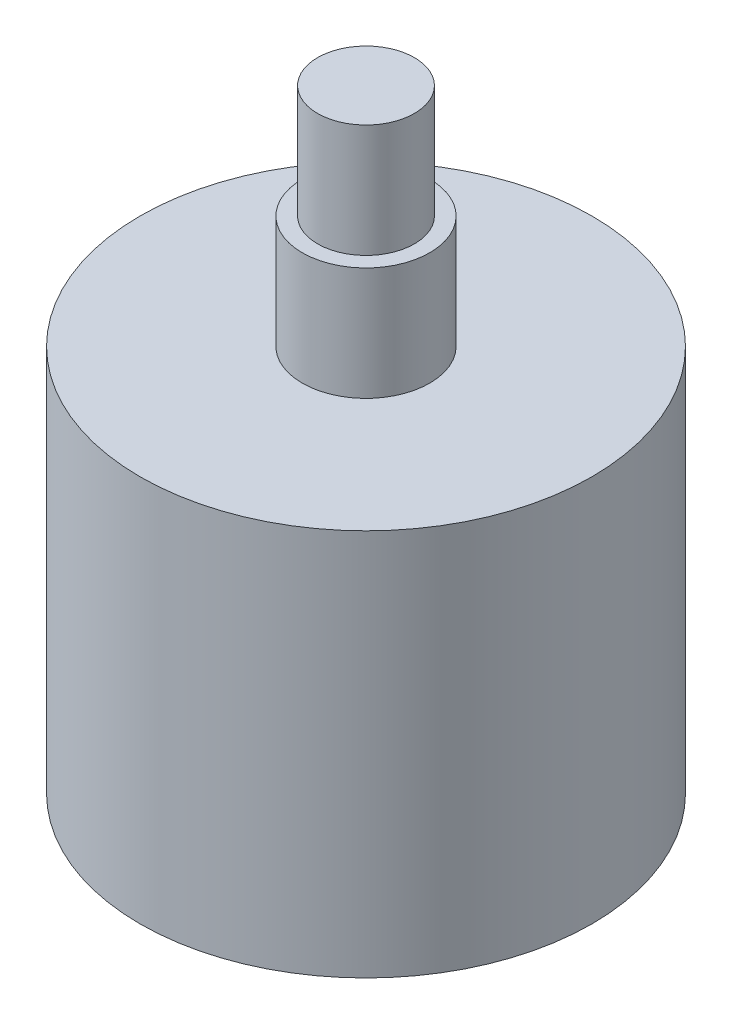
ISO-10303-21;
HEADER;
FILE_DESCRIPTION(('STEP AP214'),'2;1');
FILE_NAME('part.step','',(''),(''),'','','');
FILE_SCHEMA(('AUTOMOTIVE_DESIGN { 1 0 10303 214 1 1 1 1 }'));
ENDSEC;
DATA;
#1=APPLICATION_CONTEXT('core data for automotive mechanical design processes');
#2=APPLICATION_PROTOCOL_DEFINITION('international standard','automotive_design',2000,#1);
#3=PRODUCT_CONTEXT('',#1,'mechanical');
#4=PRODUCT('Part','Part','',(#3));
#5=PRODUCT_RELATED_PRODUCT_CATEGORY('part','',(#4));
#6=PRODUCT_DEFINITION_FORMATION('','',#4);
#7=PRODUCT_DEFINITION_CONTEXT('part definition',#1,'design');
#8=PRODUCT_DEFINITION('design','',#6,#7);
#9=PRODUCT_DEFINITION_SHAPE('','',#8);
#10=(LENGTH_UNIT() NAMED_UNIT(*) SI_UNIT(.MILLI.,.METRE.));
#11=(NAMED_UNIT(*) PLANE_ANGLE_UNIT() SI_UNIT($,.RADIAN.));
#12=(NAMED_UNIT(*) SI_UNIT($,.STERADIAN.) SOLID_ANGLE_UNIT());
#13=UNCERTAINTY_MEASURE_WITH_UNIT(LENGTH_MEASURE(1.E-05),#10,'distance_accuracy_value','');
#14=(GEOMETRIC_REPRESENTATION_CONTEXT(3) GLOBAL_UNCERTAINTY_ASSIGNED_CONTEXT((#13)) GLOBAL_UNIT_ASSIGNED_CONTEXT((#10,
#11,#12)) REPRESENTATION_CONTEXT('',''));
#15=CARTESIAN_POINT('',(0.,0.,0.));
#16=DIRECTION('',(0.,0.,1.));
#17=DIRECTION('',(1.,0.,0.));
#18=AXIS2_PLACEMENT_3D('',#15,#16,#17);
#19=CARTESIAN_POINT('',(0.,24.,0.));
#20=DIRECTION('',(0.,-1.,0.));
#21=DIRECTION('',(0.,0.,-1.));
#22=AXIS2_PLACEMENT_3D('',#19,#20,#21);
#23=CYLINDRICAL_SURFACE('',#22,14.);
#24=CARTESIAN_POINT('',(0.,24.,0.));
#25=DIRECTION('',(0.,1.,0.));
#26=DIRECTION('',(0.,0.,1.));
#27=AXIS2_PLACEMENT_3D('',#24,#25,#26);
#28=CIRCLE('',#27,14.);
#29=CARTESIAN_POINT('',(0.,24.,14.));
#30=VERTEX_POINT('',#29);
#31=EDGE_CURVE('E49',#30,#30,#28,.T.);
#32=ORIENTED_EDGE('',*,*,#31,.F.);
#33=EDGE_LOOP('',(#32));
#34=FACE_BOUND('',#33,.T.);
#35=CARTESIAN_POINT('',(0.,0.,0.));
#36=DIRECTION('',(0.,1.,0.));
#37=DIRECTION('',(0.,0.,1.));
#38=AXIS2_PLACEMENT_3D('',#35,#36,#37);
#39=CIRCLE('',#38,14.);
#40=CARTESIAN_POINT('',(0.,0.,14.));
#41=VERTEX_POINT('',#40);
#42=EDGE_CURVE('E40',#41,#41,#39,.T.);
#43=ORIENTED_EDGE('',*,*,#42,.T.);
#44=EDGE_LOOP('',(#43));
#45=FACE_BOUND('',#44,.T.);
#46=ADVANCED_FACE('F37',(#34,#45),#23,.T.);
#47=CARTESIAN_POINT('',(0.,24.,0.));
#48=DIRECTION('',(0.,1.,0.));
#49=DIRECTION('',(0.,0.,1.));
#50=AXIS2_PLACEMENT_3D('',#47,#48,#49);
#51=PLANE('',#50);
#52=CARTESIAN_POINT('',(0.,24.,0.));
#53=DIRECTION('',(0.,1.,0.));
#54=DIRECTION('',(0.,0.,1.));
#55=AXIS2_PLACEMENT_3D('',#52,#53,#54);
#56=CIRCLE('',#55,3.95);
#57=CARTESIAN_POINT('',(0.,24.,3.95));
#58=VERTEX_POINT('',#57);
#59=EDGE_CURVE('E44',#58,#58,#56,.T.);
#60=ORIENTED_EDGE('',*,*,#59,.F.);
#61=EDGE_LOOP('',(#60));
#62=FACE_BOUND('',#61,.T.);
#63=ORIENTED_EDGE('',*,*,#31,.T.);
#64=EDGE_LOOP('',(#63));
#65=FACE_BOUND('',#64,.T.);
#66=ADVANCED_FACE('F67',(#62,#65),#51,.T.);
#67=CARTESIAN_POINT('',(0.,0.,0.));
#68=DIRECTION('',(0.,1.,0.));
#69=DIRECTION('',(0.,0.,1.));
#70=AXIS2_PLACEMENT_3D('',#67,#68,#69);
#71=PLANE('',#70);
#72=CARTESIAN_POINT('',(9.5,0.,0.));
#73=DIRECTION('',(0.,-1.,0.));
#74=DIRECTION('',(0.,0.,-1.));
#75=AXIS2_PLACEMENT_3D('',#72,#73,#74);
#76=CIRCLE('',#75,1.5);
#77=CARTESIAN_POINT('',(9.5,0.,-1.5));
#78=VERTEX_POINT('',#77);
#79=EDGE_CURVE('E214',#78,#78,#76,.T.);
#80=ORIENTED_EDGE('',*,*,#79,.F.);
#81=EDGE_LOOP('',(#80));
#82=FACE_BOUND('',#81,.T.);
#83=CARTESIAN_POINT('',(0.,0.,-9.5));
#84=DIRECTION('',(0.,-1.,0.));
#85=DIRECTION('',(0.,0.,-1.));
#86=AXIS2_PLACEMENT_3D('',#83,#84,#85);
#87=CIRCLE('',#86,1.5);
#88=CARTESIAN_POINT('',(0.,0.,-11.));
#89=VERTEX_POINT('',#88);
#90=EDGE_CURVE('E223',#89,#89,#87,.T.);
#91=ORIENTED_EDGE('',*,*,#90,.F.);
#92=EDGE_LOOP('',(#91));
#93=FACE_BOUND('',#92,.T.);
#94=CARTESIAN_POINT('',(-9.5,0.,0.));
#95=DIRECTION('',(0.,-1.,0.));
#96=DIRECTION('',(0.,0.,-1.));
#97=AXIS2_PLACEMENT_3D('',#94,#95,#96);
#98=CIRCLE('',#97,1.5);
#99=CARTESIAN_POINT('',(-9.5,0.,-1.5));
#100=VERTEX_POINT('',#99);
#101=EDGE_CURVE('E229',#100,#100,#98,.T.);
#102=ORIENTED_EDGE('',*,*,#101,.F.);
#103=EDGE_LOOP('',(#102));
#104=FACE_BOUND('',#103,.T.);
#105=CARTESIAN_POINT('',(0.,0.,9.5));
#106=DIRECTION('',(0.,-1.,0.));
#107=DIRECTION('',(0.,0.,-1.));
#108=AXIS2_PLACEMENT_3D('',#105,#106,#107);
#109=CIRCLE('',#108,1.5);
#110=CARTESIAN_POINT('',(0.,0.,8.));
#111=VERTEX_POINT('',#110);
#112=EDGE_CURVE('E234',#111,#111,#109,.T.);
#113=ORIENTED_EDGE('',*,*,#112,.F.);
#114=EDGE_LOOP('',(#113));
#115=FACE_BOUND('',#114,.T.);
#116=ORIENTED_EDGE('',*,*,#42,.F.);
#117=EDGE_LOOP('',(#116));
#118=FACE_BOUND('',#117,.T.);
#119=ADVANCED_FACE('F64',(#82,#93,#104,#115,#118),#71,.F.);
#120=CARTESIAN_POINT('',(0.,31.,0.));
#121=DIRECTION('',(0.,-1.,0.));
#122=DIRECTION('',(0.,0.,-1.));
#123=AXIS2_PLACEMENT_3D('',#120,#121,#122);
#124=CYLINDRICAL_SURFACE('',#123,3.95);
#125=CARTESIAN_POINT('',(0.,31.,0.));
#126=DIRECTION('',(0.,1.,0.));
#127=DIRECTION('',(0.,0.,1.));
#128=AXIS2_PLACEMENT_3D('',#125,#126,#127);
#129=CIRCLE('',#128,3.95);
#130=CARTESIAN_POINT('',(0.,31.,3.95));
#131=VERTEX_POINT('',#130);
#132=EDGE_CURVE('E55',#131,#131,#129,.T.);
#133=ORIENTED_EDGE('',*,*,#132,.F.);
#134=EDGE_LOOP('',(#133));
#135=FACE_BOUND('',#134,.T.);
#136=ORIENTED_EDGE('',*,*,#59,.T.);
#137=EDGE_LOOP('',(#136));
#138=FACE_BOUND('',#137,.T.);
#139=ADVANCED_FACE('F66',(#135,#138),#124,.T.);
#140=CARTESIAN_POINT('',(0.,31.,0.));
#141=DIRECTION('',(0.,1.,0.));
#142=DIRECTION('',(0.,0.,1.));
#143=AXIS2_PLACEMENT_3D('',#140,#141,#142);
#144=PLANE('',#143);
#145=CARTESIAN_POINT('',(0.,31.,0.));
#146=DIRECTION('',(0.,1.,0.));
#147=DIRECTION('',(0.,0.,1.));
#148=AXIS2_PLACEMENT_3D('',#145,#146,#147);
#149=CIRCLE('',#148,3.);
#150=CARTESIAN_POINT('',(0.,31.,3.));
#151=VERTEX_POINT('',#150);
#152=EDGE_CURVE('E10',#151,#151,#149,.T.);
#153=ORIENTED_EDGE('',*,*,#152,.F.);
#154=EDGE_LOOP('',(#153));
#155=FACE_BOUND('',#154,.T.);
#156=ORIENTED_EDGE('',*,*,#132,.T.);
#157=EDGE_LOOP('',(#156));
#158=FACE_BOUND('',#157,.T.);
#159=ADVANCED_FACE('F73',(#155,#158),#144,.T.);
#160=CARTESIAN_POINT('',(0.,38.,0.));
#161=DIRECTION('',(0.,-1.,0.));
#162=DIRECTION('',(0.,0.,-1.));
#163=AXIS2_PLACEMENT_3D('',#160,#161,#162);
#164=CYLINDRICAL_SURFACE('',#163,3.);
#165=CARTESIAN_POINT('',(0.,38.,0.));
#166=DIRECTION('',(0.,1.,0.));
#167=DIRECTION('',(0.,0.,1.));
#168=AXIS2_PLACEMENT_3D('',#165,#166,#167);
#169=CIRCLE('',#168,3.);
#170=CARTESIAN_POINT('',(0.,38.,3.));
#171=VERTEX_POINT('',#170);
#172=EDGE_CURVE('E53',#171,#171,#169,.T.);
#173=ORIENTED_EDGE('',*,*,#172,.F.);
#174=EDGE_LOOP('',(#173));
#175=FACE_BOUND('',#174,.T.);
#176=ORIENTED_EDGE('',*,*,#152,.T.);
#177=EDGE_LOOP('',(#176));
#178=FACE_BOUND('',#177,.T.);
#179=ADVANCED_FACE('F104',(#175,#178),#164,.T.);
#180=CARTESIAN_POINT('',(0.,38.,0.));
#181=DIRECTION('',(0.,1.,0.));
#182=DIRECTION('',(0.,0.,1.));
#183=AXIS2_PLACEMENT_3D('',#180,#181,#182);
#184=PLANE('',#183);
#185=ORIENTED_EDGE('',*,*,#172,.T.);
#186=EDGE_LOOP('',(#185));
#187=FACE_BOUND('',#186,.T.);
#188=ADVANCED_FACE('F114',(#187),#184,.T.);
#189=CARTESIAN_POINT('',(0.,5.,9.5));
#190=DIRECTION('',(0.,-1.,0.));
#191=DIRECTION('',(0.,0.,-1.));
#192=AXIS2_PLACEMENT_3D('',#189,#190,#191);
#193=CYLINDRICAL_SURFACE('',#192,1.5);
#194=CARTESIAN_POINT('',(0.,5.,9.5));
#195=DIRECTION('',(0.,-1.,0.));
#196=DIRECTION('',(0.,0.,-1.));
#197=AXIS2_PLACEMENT_3D('',#194,#195,#196);
#198=CIRCLE('',#197,1.5);
#199=CARTESIAN_POINT('',(0.,5.,8.));
#200=VERTEX_POINT('',#199);
#201=EDGE_CURVE('E232',#200,#200,#198,.T.);
#202=ORIENTED_EDGE('',*,*,#201,.F.);
#203=EDGE_LOOP('',(#202));
#204=FACE_BOUND('',#203,.T.);
#205=ORIENTED_EDGE('',*,*,#112,.T.);
#206=EDGE_LOOP('',(#205));
#207=FACE_BOUND('',#206,.T.);
#208=ADVANCED_FACE('F123',(#204,#207),#193,.F.);
#209=CARTESIAN_POINT('',(0.,5.,9.5));
#210=DIRECTION('',(0.,-1.,0.));
#211=DIRECTION('',(0.,0.,-1.));
#212=AXIS2_PLACEMENT_3D('',#209,#210,#211);
#213=PLANE('',#212);
#214=ORIENTED_EDGE('',*,*,#201,.T.);
#215=EDGE_LOOP('',(#214));
#216=FACE_BOUND('',#215,.T.);
#217=ADVANCED_FACE('F137',(#216),#213,.T.);
#218=CARTESIAN_POINT('',(-9.5,5.,0.));
#219=DIRECTION('',(0.,-1.,0.));
#220=DIRECTION('',(0.,0.,-1.));
#221=AXIS2_PLACEMENT_3D('',#218,#219,#220);
#222=CYLINDRICAL_SURFACE('',#221,1.5);
#223=CARTESIAN_POINT('',(-9.5,5.,0.));
#224=DIRECTION('',(0.,-1.,0.));
#225=DIRECTION('',(0.,0.,-1.));
#226=AXIS2_PLACEMENT_3D('',#223,#224,#225);
#227=CIRCLE('',#226,1.5);
#228=CARTESIAN_POINT('',(-9.5,5.,-1.5));
#229=VERTEX_POINT('',#228);
#230=EDGE_CURVE('E226',#229,#229,#227,.T.);
#231=ORIENTED_EDGE('',*,*,#230,.F.);
#232=EDGE_LOOP('',(#231));
#233=FACE_BOUND('',#232,.T.);
#234=ORIENTED_EDGE('',*,*,#101,.T.);
#235=EDGE_LOOP('',(#234));
#236=FACE_BOUND('',#235,.T.);
#237=ADVANCED_FACE('F147',(#233,#236),#222,.F.);
#238=CARTESIAN_POINT('',(-9.5,5.,0.));
#239=DIRECTION('',(0.,-1.,0.));
#240=DIRECTION('',(0.,0.,-1.));
#241=AXIS2_PLACEMENT_3D('',#238,#239,#240);
#242=PLANE('',#241);
#243=ORIENTED_EDGE('',*,*,#230,.T.);
#244=EDGE_LOOP('',(#243));
#245=FACE_BOUND('',#244,.T.);
#246=ADVANCED_FACE('F157',(#245),#242,.T.);
#247=CARTESIAN_POINT('',(0.,5.,-9.5));
#248=DIRECTION('',(0.,-1.,0.));
#249=DIRECTION('',(0.,0.,-1.));
#250=AXIS2_PLACEMENT_3D('',#247,#248,#249);
#251=CYLINDRICAL_SURFACE('',#250,1.5);
#252=CARTESIAN_POINT('',(0.,5.,-9.5));
#253=DIRECTION('',(0.,-1.,0.));
#254=DIRECTION('',(0.,0.,-1.));
#255=AXIS2_PLACEMENT_3D('',#252,#253,#254);
#256=CIRCLE('',#255,1.5);
#257=CARTESIAN_POINT('',(0.,5.,-11.));
#258=VERTEX_POINT('',#257);
#259=EDGE_CURVE('E218',#258,#258,#256,.T.);
#260=ORIENTED_EDGE('',*,*,#259,.F.);
#261=EDGE_LOOP('',(#260));
#262=FACE_BOUND('',#261,.T.);
#263=ORIENTED_EDGE('',*,*,#90,.T.);
#264=EDGE_LOOP('',(#263));
#265=FACE_BOUND('',#264,.T.);
#266=ADVANCED_FACE('F167',(#262,#265),#251,.F.);
#267=CARTESIAN_POINT('',(0.,5.,-9.5));
#268=DIRECTION('',(0.,-1.,0.));
#269=DIRECTION('',(0.,0.,-1.));
#270=AXIS2_PLACEMENT_3D('',#267,#268,#269);
#271=PLANE('',#270);
#272=ORIENTED_EDGE('',*,*,#259,.T.);
#273=EDGE_LOOP('',(#272));
#274=FACE_BOUND('',#273,.T.);
#275=ADVANCED_FACE('F177',(#274),#271,.T.);
#276=CARTESIAN_POINT('',(9.5,5.,0.));
#277=DIRECTION('',(0.,-1.,0.));
#278=DIRECTION('',(0.,0.,-1.));
#279=AXIS2_PLACEMENT_3D('',#276,#277,#278);
#280=CYLINDRICAL_SURFACE('',#279,1.5);
#281=CARTESIAN_POINT('',(9.5,5.,0.));
#282=DIRECTION('',(0.,-1.,0.));
#283=DIRECTION('',(0.,0.,-1.));
#284=AXIS2_PLACEMENT_3D('',#281,#282,#283);
#285=CIRCLE('',#284,1.5);
#286=CARTESIAN_POINT('',(9.5,5.,-1.5));
#287=VERTEX_POINT('',#286);
#288=EDGE_CURVE('E213',#287,#287,#285,.T.);
#289=ORIENTED_EDGE('',*,*,#288,.F.);
#290=EDGE_LOOP('',(#289));
#291=FACE_BOUND('',#290,.T.);
#292=ORIENTED_EDGE('',*,*,#79,.T.);
#293=EDGE_LOOP('',(#292));
#294=FACE_BOUND('',#293,.T.);
#295=ADVANCED_FACE('F187',(#291,#294),#280,.F.);
#296=CARTESIAN_POINT('',(9.5,5.,0.));
#297=DIRECTION('',(0.,-1.,0.));
#298=DIRECTION('',(0.,0.,-1.));
#299=AXIS2_PLACEMENT_3D('',#296,#297,#298);
#300=PLANE('',#299);
#301=ORIENTED_EDGE('',*,*,#288,.T.);
#302=EDGE_LOOP('',(#301));
#303=FACE_BOUND('',#302,.T.);
#304=ADVANCED_FACE('F197',(#303),#300,.T.);
#305=CLOSED_SHELL('',(#46,#66,#119,#139,#159,#179,#188,#208,#217,#237,#246,#266,#275,#295,#304));
#306=MANIFOLD_SOLID_BREP('B2',#305);
#307=ADVANCED_BREP_SHAPE_REPRESENTATION('',(#18,#306),#14);
#308=SHAPE_DEFINITION_REPRESENTATION(#9,#307);
ENDSEC;
END-ISO-10303-21;
